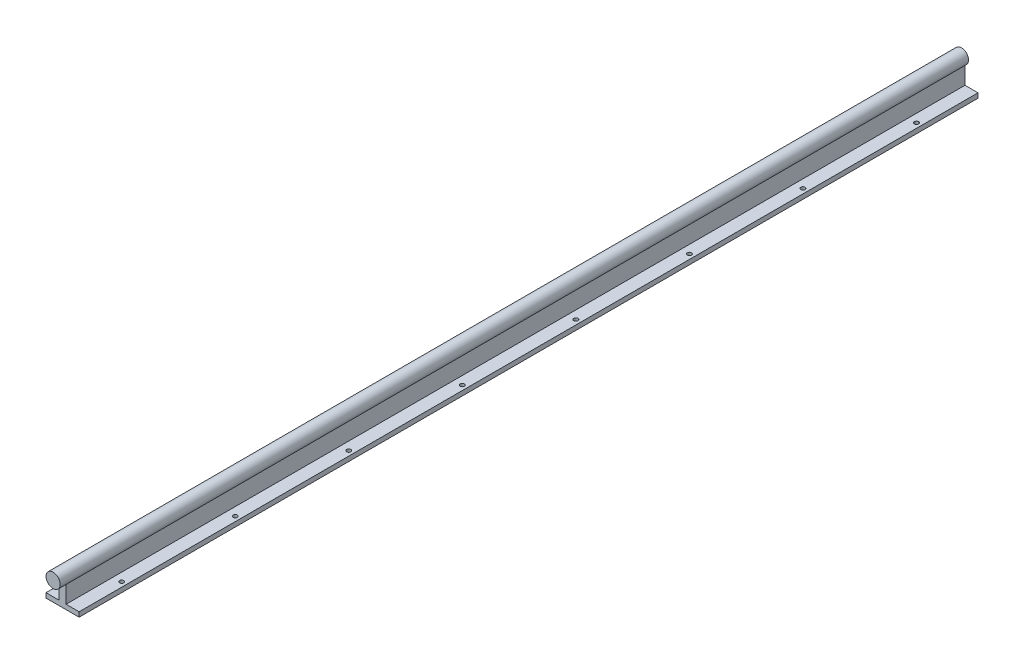
ISO-10303-21;
HEADER;
FILE_DESCRIPTION(('STEP AP214'),'2;1');
FILE_NAME('part.step','',(''),(''),'','','');
FILE_SCHEMA(('AUTOMOTIVE_DESIGN { 1 0 10303 214 1 1 1 1 }'));
ENDSEC;
DATA;
#1=APPLICATION_CONTEXT('core data for automotive mechanical design processes');
#2=APPLICATION_PROTOCOL_DEFINITION('international standard','automotive_design',2000,#1);
#3=PRODUCT_CONTEXT('',#1,'mechanical');
#4=PRODUCT('Part','Part','',(#3));
#5=PRODUCT_RELATED_PRODUCT_CATEGORY('part','',(#4));
#6=PRODUCT_DEFINITION_FORMATION('','',#4);
#7=PRODUCT_DEFINITION_CONTEXT('part definition',#1,'design');
#8=PRODUCT_DEFINITION('design','',#6,#7);
#9=PRODUCT_DEFINITION_SHAPE('','',#8);
#10=(LENGTH_UNIT() NAMED_UNIT(*) SI_UNIT(.MILLI.,.METRE.));
#11=(NAMED_UNIT(*) PLANE_ANGLE_UNIT() SI_UNIT($,.RADIAN.));
#12=(NAMED_UNIT(*) SI_UNIT($,.STERADIAN.) SOLID_ANGLE_UNIT());
#13=UNCERTAINTY_MEASURE_WITH_UNIT(LENGTH_MEASURE(1.E-05),#10,'distance_accuracy_value','');
#14=(GEOMETRIC_REPRESENTATION_CONTEXT(3) GLOBAL_UNCERTAINTY_ASSIGNED_CONTEXT((#13)) GLOBAL_UNIT_ASSIGNED_CONTEXT((#10,
#11,#12)) REPRESENTATION_CONTEXT('',''));
#15=CARTESIAN_POINT('',(0.,0.,0.));
#16=DIRECTION('',(0.,0.,1.));
#17=DIRECTION('',(1.,0.,0.));
#18=AXIS2_PLACEMENT_3D('',#15,#16,#17);
#19=CARTESIAN_POINT('',(-22.225,-38.1,1219.2));
#20=DIRECTION('',(1.,0.,0.));
#21=DIRECTION('',(0.,1.,0.));
#22=AXIS2_PLACEMENT_3D('',#19,#20,#21);
#23=PLANE('',#22);
#24=DIRECTION('',(0.,-1.,0.));
#25=VECTOR('',#24,1.);
#26=CARTESIAN_POINT('',(-22.225,-38.1,1206.5));
#27=LINE('',#26,#25);
#28=CARTESIAN_POINT('',(-22.225,-31.75,1206.5));
#29=VERTEX_POINT('',#28);
#30=CARTESIAN_POINT('',(-22.225,-38.1,1206.5));
#31=VERTEX_POINT('',#30);
#32=EDGE_CURVE('E110',#29,#31,#27,.T.);
#33=ORIENTED_EDGE('',*,*,#32,.F.);
#34=DIRECTION('',(0.,0.,-1.));
#35=VECTOR('',#34,1.);
#36=CARTESIAN_POINT('',(-22.225,-31.75,1219.2));
#37=LINE('',#36,#35);
#38=CARTESIAN_POINT('',(-22.225,-31.75,0.));
#39=VERTEX_POINT('',#38);
#40=EDGE_CURVE('E45',#29,#39,#37,.T.);
#41=ORIENTED_EDGE('',*,*,#40,.T.);
#42=DIRECTION('',(0.,-1.,0.));
#43=VECTOR('',#42,1.);
#44=CARTESIAN_POINT('',(-22.225,-38.1,0.));
#45=LINE('',#44,#43);
#46=CARTESIAN_POINT('',(-22.225,-38.1,0.));
#47=VERTEX_POINT('',#46);
#48=EDGE_CURVE('E256',#39,#47,#45,.T.);
#49=ORIENTED_EDGE('',*,*,#48,.T.);
#50=DIRECTION('',(0.,0.,-1.));
#51=VECTOR('',#50,1.);
#52=CARTESIAN_POINT('',(-22.225,-38.1,1219.2));
#53=LINE('',#52,#51);
#54=EDGE_CURVE('E129',#31,#47,#53,.T.);
#55=ORIENTED_EDGE('',*,*,#54,.F.);
#56=EDGE_LOOP('',(#33,#41,#49,#55));
#57=FACE_BOUND('',#56,.T.);
#58=ADVANCED_FACE('F30',(#57),#23,.F.);
#59=CARTESIAN_POINT('',(-22.225,-38.1,1219.2));
#60=DIRECTION('',(0.,1.,0.));
#61=DIRECTION('',(0.,0.,1.));
#62=AXIS2_PLACEMENT_3D('',#59,#60,#61);
#63=PLANE('',#62);
#64=CARTESIAN_POINT('',(15.875,-38.1,1143.));
#65=DIRECTION('',(0.,-1.,0.));
#66=DIRECTION('',(0.,0.,-1.));
#67=AXIS2_PLACEMENT_3D('',#64,#65,#66);
#68=CIRCLE('',#67,2.80669999999999);
#69=CARTESIAN_POINT('',(15.875,-38.1,1140.1933));
#70=VERTEX_POINT('',#69);
#71=EDGE_CURVE('E38',#70,#70,#68,.T.);
#72=ORIENTED_EDGE('',*,*,#71,.F.);
#73=EDGE_LOOP('',(#72));
#74=FACE_BOUND('',#73,.T.);
#75=CARTESIAN_POINT('',(15.875,-38.1,990.6));
#76=DIRECTION('',(0.,-1.,0.));
#77=DIRECTION('',(0.,0.,-1.));
#78=AXIS2_PLACEMENT_3D('',#75,#76,#77);
#79=CIRCLE('',#78,2.80669999999999);
#80=CARTESIAN_POINT('',(15.875,-38.1,987.7933));
#81=VERTEX_POINT('',#80);
#82=EDGE_CURVE('E194',#81,#81,#79,.T.);
#83=ORIENTED_EDGE('',*,*,#82,.F.);
#84=EDGE_LOOP('',(#83));
#85=FACE_BOUND('',#84,.T.);
#86=CARTESIAN_POINT('',(15.875,-38.1,838.2));
#87=DIRECTION('',(0.,-1.,0.));
#88=DIRECTION('',(0.,0.,-1.));
#89=AXIS2_PLACEMENT_3D('',#86,#87,#88);
#90=CIRCLE('',#89,2.80669999999999);
#91=CARTESIAN_POINT('',(15.875,-38.1,835.3933));
#92=VERTEX_POINT('',#91);
#93=EDGE_CURVE('E188',#92,#92,#90,.T.);
#94=ORIENTED_EDGE('',*,*,#93,.F.);
#95=EDGE_LOOP('',(#94));
#96=FACE_BOUND('',#95,.T.);
#97=CARTESIAN_POINT('',(15.875,-38.1,685.8));
#98=DIRECTION('',(0.,-1.,0.));
#99=DIRECTION('',(0.,0.,-1.));
#100=AXIS2_PLACEMENT_3D('',#97,#98,#99);
#101=CIRCLE('',#100,2.80669999999999);
#102=CARTESIAN_POINT('',(15.875,-38.1,682.9933));
#103=VERTEX_POINT('',#102);
#104=EDGE_CURVE('E182',#103,#103,#101,.T.);
#105=ORIENTED_EDGE('',*,*,#104,.F.);
#106=EDGE_LOOP('',(#105));
#107=FACE_BOUND('',#106,.T.);
#108=CARTESIAN_POINT('',(15.875,-38.1,533.4));
#109=DIRECTION('',(0.,-1.,0.));
#110=DIRECTION('',(0.,0.,-1.));
#111=AXIS2_PLACEMENT_3D('',#108,#109,#110);
#112=CIRCLE('',#111,2.80669999999999);
#113=CARTESIAN_POINT('',(15.875,-38.1,530.5933));
#114=VERTEX_POINT('',#113);
#115=EDGE_CURVE('E176',#114,#114,#112,.T.);
#116=ORIENTED_EDGE('',*,*,#115,.F.);
#117=EDGE_LOOP('',(#116));
#118=FACE_BOUND('',#117,.T.);
#119=CARTESIAN_POINT('',(15.875,-38.1,381.));
#120=DIRECTION('',(0.,-1.,0.));
#121=DIRECTION('',(0.,0.,-1.));
#122=AXIS2_PLACEMENT_3D('',#119,#120,#121);
#123=CIRCLE('',#122,2.80669999999999);
#124=CARTESIAN_POINT('',(15.875,-38.1,378.1933));
#125=VERTEX_POINT('',#124);
#126=EDGE_CURVE('E170',#125,#125,#123,.T.);
#127=ORIENTED_EDGE('',*,*,#126,.F.);
#128=EDGE_LOOP('',(#127));
#129=FACE_BOUND('',#128,.T.);
#130=CARTESIAN_POINT('',(-15.875,-38.1,1143.));
#131=DIRECTION('',(0.,-1.,0.));
#132=DIRECTION('',(0.,0.,-1.));
#133=AXIS2_PLACEMENT_3D('',#130,#131,#132);
#134=CIRCLE('',#133,2.80669999999999);
#135=CARTESIAN_POINT('',(-15.875,-38.1,1140.1933));
#136=VERTEX_POINT('',#135);
#137=EDGE_CURVE('E164',#136,#136,#134,.T.);
#138=ORIENTED_EDGE('',*,*,#137,.F.);
#139=EDGE_LOOP('',(#138));
#140=FACE_BOUND('',#139,.T.);
#141=CARTESIAN_POINT('',(-15.875,-38.1,990.6));
#142=DIRECTION('',(0.,-1.,0.));
#143=DIRECTION('',(0.,0.,-1.));
#144=AXIS2_PLACEMENT_3D('',#141,#142,#143);
#145=CIRCLE('',#144,2.80669999999999);
#146=CARTESIAN_POINT('',(-15.875,-38.1,987.7933));
#147=VERTEX_POINT('',#146);
#148=EDGE_CURVE('E158',#147,#147,#145,.T.);
#149=ORIENTED_EDGE('',*,*,#148,.F.);
#150=EDGE_LOOP('',(#149));
#151=FACE_BOUND('',#150,.T.);
#152=CARTESIAN_POINT('',(-15.875,-38.1,838.2));
#153=DIRECTION('',(0.,-1.,0.));
#154=DIRECTION('',(0.,0.,-1.));
#155=AXIS2_PLACEMENT_3D('',#152,#153,#154);
#156=CIRCLE('',#155,2.80669999999999);
#157=CARTESIAN_POINT('',(-15.875,-38.1,835.3933));
#158=VERTEX_POINT('',#157);
#159=EDGE_CURVE('E152',#158,#158,#156,.T.);
#160=ORIENTED_EDGE('',*,*,#159,.F.);
#161=EDGE_LOOP('',(#160));
#162=FACE_BOUND('',#161,.T.);
#163=CARTESIAN_POINT('',(-15.875,-38.1,685.8));
#164=DIRECTION('',(0.,-1.,0.));
#165=DIRECTION('',(0.,0.,-1.));
#166=AXIS2_PLACEMENT_3D('',#163,#164,#165);
#167=CIRCLE('',#166,2.80669999999999);
#168=CARTESIAN_POINT('',(-15.875,-38.1,682.9933));
#169=VERTEX_POINT('',#168);
#170=EDGE_CURVE('E146',#169,#169,#167,.T.);
#171=ORIENTED_EDGE('',*,*,#170,.F.);
#172=EDGE_LOOP('',(#171));
#173=FACE_BOUND('',#172,.T.);
#174=CARTESIAN_POINT('',(-15.875,-38.1,533.4));
#175=DIRECTION('',(0.,-1.,0.));
#176=DIRECTION('',(0.,0.,-1.));
#177=AXIS2_PLACEMENT_3D('',#174,#175,#176);
#178=CIRCLE('',#177,2.80669999999999);
#179=CARTESIAN_POINT('',(-15.875,-38.1,530.5933));
#180=VERTEX_POINT('',#179);
#181=EDGE_CURVE('E140',#180,#180,#178,.T.);
#182=ORIENTED_EDGE('',*,*,#181,.F.);
#183=EDGE_LOOP('',(#182));
#184=FACE_BOUND('',#183,.T.);
#185=CARTESIAN_POINT('',(-15.875,-38.1,381.));
#186=DIRECTION('',(0.,-1.,0.));
#187=DIRECTION('',(0.,0.,-1.));
#188=AXIS2_PLACEMENT_3D('',#185,#186,#187);
#189=CIRCLE('',#188,2.80669999999999);
#190=CARTESIAN_POINT('',(-15.875,-38.1,378.1933));
#191=VERTEX_POINT('',#190);
#192=EDGE_CURVE('E134',#191,#191,#189,.T.);
#193=ORIENTED_EDGE('',*,*,#192,.F.);
#194=EDGE_LOOP('',(#193));
#195=FACE_BOUND('',#194,.T.);
#196=CARTESIAN_POINT('',(15.875,-38.1,76.2));
#197=DIRECTION('',(0.,-1.,0.));
#198=DIRECTION('',(0.,0.,-1.));
#199=AXIS2_PLACEMENT_3D('',#196,#197,#198);
#200=CIRCLE('',#199,2.80669999999999);
#201=CARTESIAN_POINT('',(15.875,-38.1,73.3933));
#202=VERTEX_POINT('',#201);
#203=EDGE_CURVE('E233',#202,#202,#200,.T.);
#204=ORIENTED_EDGE('',*,*,#203,.F.);
#205=EDGE_LOOP('',(#204));
#206=FACE_BOUND('',#205,.T.);
#207=CARTESIAN_POINT('',(-15.875,-38.1,76.2));
#208=DIRECTION('',(0.,-1.,0.));
#209=DIRECTION('',(0.,0.,-1.));
#210=AXIS2_PLACEMENT_3D('',#207,#208,#209);
#211=CIRCLE('',#210,2.80669999999999);
#212=CARTESIAN_POINT('',(-15.875,-38.1,73.3933));
#213=VERTEX_POINT('',#212);
#214=EDGE_CURVE('E237',#213,#213,#211,.T.);
#215=ORIENTED_EDGE('',*,*,#214,.F.);
#216=EDGE_LOOP('',(#215));
#217=FACE_BOUND('',#216,.T.);
#218=CARTESIAN_POINT('',(-15.875,-38.1,228.6));
#219=DIRECTION('',(0.,-1.,0.));
#220=DIRECTION('',(0.,0.,-1.));
#221=AXIS2_PLACEMENT_3D('',#218,#219,#220);
#222=CIRCLE('',#221,2.80669999999999);
#223=CARTESIAN_POINT('',(-15.875,-38.1,225.7933));
#224=VERTEX_POINT('',#223);
#225=EDGE_CURVE('E241',#224,#224,#222,.T.);
#226=ORIENTED_EDGE('',*,*,#225,.F.);
#227=EDGE_LOOP('',(#226));
#228=FACE_BOUND('',#227,.T.);
#229=CARTESIAN_POINT('',(15.875,-38.1,228.6));
#230=DIRECTION('',(0.,-1.,0.));
#231=DIRECTION('',(0.,0.,-1.));
#232=AXIS2_PLACEMENT_3D('',#229,#230,#231);
#233=CIRCLE('',#232,2.80669999999999);
#234=CARTESIAN_POINT('',(15.875,-38.1,225.7933));
#235=VERTEX_POINT('',#234);
#236=EDGE_CURVE('E245',#235,#235,#233,.T.);
#237=ORIENTED_EDGE('',*,*,#236,.F.);
#238=EDGE_LOOP('',(#237));
#239=FACE_BOUND('',#238,.T.);
#240=DIRECTION('',(1.,0.,0.));
#241=VECTOR('',#240,1.);
#242=CARTESIAN_POINT('',(-22.225,-38.1,1206.5));
#243=LINE('',#242,#241);
#244=CARTESIAN_POINT('',(22.225,-38.1,1206.5));
#245=VERTEX_POINT('',#244);
#246=EDGE_CURVE('E248',#31,#245,#243,.T.);
#247=ORIENTED_EDGE('',*,*,#246,.F.);
#248=ORIENTED_EDGE('',*,*,#54,.T.);
#249=DIRECTION('',(1.,0.,0.));
#250=VECTOR('',#249,1.);
#251=CARTESIAN_POINT('',(-22.225,-38.1,0.));
#252=LINE('',#251,#250);
#253=CARTESIAN_POINT('',(22.225,-38.1,0.));
#254=VERTEX_POINT('',#253);
#255=EDGE_CURVE('E259',#47,#254,#252,.T.);
#256=ORIENTED_EDGE('',*,*,#255,.T.);
#257=DIRECTION('',(0.,0.,-1.));
#258=VECTOR('',#257,1.);
#259=CARTESIAN_POINT('',(22.225,-38.1,1219.2));
#260=LINE('',#259,#258);
#261=EDGE_CURVE('E127',#245,#254,#260,.T.);
#262=ORIENTED_EDGE('',*,*,#261,.F.);
#263=EDGE_LOOP('',(#247,#248,#256,#262));
#264=FACE_BOUND('',#263,.T.);
#265=ADVANCED_FACE('F203',(#74,#85,#96,#107,#118,#129,#140,#151,#162,#173,#184,#195,#206,#217,
#228,#239,#264),#63,.F.);
#266=CARTESIAN_POINT('',(22.225,-38.1,1219.2));
#267=DIRECTION('',(-1.,0.,0.));
#268=DIRECTION('',(0.,-1.,0.));
#269=AXIS2_PLACEMENT_3D('',#266,#267,#268);
#270=PLANE('',#269);
#271=DIRECTION('',(0.,1.,0.));
#272=VECTOR('',#271,1.);
#273=CARTESIAN_POINT('',(22.225,-38.1,1206.5));
#274=LINE('',#273,#272);
#275=CARTESIAN_POINT('',(22.225,-31.75,1206.5));
#276=VERTEX_POINT('',#275);
#277=EDGE_CURVE('E253',#245,#276,#274,.T.);
#278=ORIENTED_EDGE('',*,*,#277,.F.);
#279=ORIENTED_EDGE('',*,*,#261,.T.);
#280=DIRECTION('',(0.,1.,0.));
#281=VECTOR('',#280,1.);
#282=CARTESIAN_POINT('',(22.225,-38.1,0.));
#283=LINE('',#282,#281);
#284=CARTESIAN_POINT('',(22.225,-31.75,0.));
#285=VERTEX_POINT('',#284);
#286=EDGE_CURVE('E262',#254,#285,#283,.T.);
#287=ORIENTED_EDGE('',*,*,#286,.T.);
#288=DIRECTION('',(0.,0.,-1.));
#289=VECTOR('',#288,1.);
#290=CARTESIAN_POINT('',(22.225,-31.75,1219.2));
#291=LINE('',#290,#289);
#292=EDGE_CURVE('E125',#276,#285,#291,.T.);
#293=ORIENTED_EDGE('',*,*,#292,.F.);
#294=EDGE_LOOP('',(#278,#279,#287,#293));
#295=FACE_BOUND('',#294,.T.);
#296=ADVANCED_FACE('F206',(#295),#270,.F.);
#297=CARTESIAN_POINT('',(22.225,-31.75,1219.2));
#298=DIRECTION('',(0.,-1.,0.));
#299=DIRECTION('',(0.,0.,-1.));
#300=AXIS2_PLACEMENT_3D('',#297,#298,#299);
#301=PLANE('',#300);
#302=CARTESIAN_POINT('',(15.875,-31.75,1143.));
#303=DIRECTION('',(0.,-1.,0.));
#304=DIRECTION('',(0.,0.,-1.));
#305=AXIS2_PLACEMENT_3D('',#302,#303,#304);
#306=CIRCLE('',#305,2.80669999999999);
#307=CARTESIAN_POINT('',(15.875,-31.75,1140.1933));
#308=VERTEX_POINT('',#307);
#309=EDGE_CURVE('E197',#308,#308,#306,.T.);
#310=ORIENTED_EDGE('',*,*,#309,.T.);
#311=EDGE_LOOP('',(#310));
#312=FACE_BOUND('',#311,.T.);
#313=CARTESIAN_POINT('',(15.875,-31.75,990.6));
#314=DIRECTION('',(0.,-1.,0.));
#315=DIRECTION('',(0.,0.,-1.));
#316=AXIS2_PLACEMENT_3D('',#313,#314,#315);
#317=CIRCLE('',#316,2.80669999999999);
#318=CARTESIAN_POINT('',(15.875,-31.75,987.7933));
#319=VERTEX_POINT('',#318);
#320=EDGE_CURVE('E191',#319,#319,#317,.T.);
#321=ORIENTED_EDGE('',*,*,#320,.T.);
#322=EDGE_LOOP('',(#321));
#323=FACE_BOUND('',#322,.T.);
#324=CARTESIAN_POINT('',(15.875,-31.75,838.2));
#325=DIRECTION('',(0.,-1.,0.));
#326=DIRECTION('',(0.,0.,-1.));
#327=AXIS2_PLACEMENT_3D('',#324,#325,#326);
#328=CIRCLE('',#327,2.80669999999999);
#329=CARTESIAN_POINT('',(15.875,-31.75,835.3933));
#330=VERTEX_POINT('',#329);
#331=EDGE_CURVE('E185',#330,#330,#328,.T.);
#332=ORIENTED_EDGE('',*,*,#331,.T.);
#333=EDGE_LOOP('',(#332));
#334=FACE_BOUND('',#333,.T.);
#335=CARTESIAN_POINT('',(15.875,-31.75,685.8));
#336=DIRECTION('',(0.,-1.,0.));
#337=DIRECTION('',(0.,0.,-1.));
#338=AXIS2_PLACEMENT_3D('',#335,#336,#337);
#339=CIRCLE('',#338,2.80669999999999);
#340=CARTESIAN_POINT('',(15.875,-31.75,682.9933));
#341=VERTEX_POINT('',#340);
#342=EDGE_CURVE('E179',#341,#341,#339,.T.);
#343=ORIENTED_EDGE('',*,*,#342,.T.);
#344=EDGE_LOOP('',(#343));
#345=FACE_BOUND('',#344,.T.);
#346=CARTESIAN_POINT('',(15.875,-31.75,533.4));
#347=DIRECTION('',(0.,-1.,0.));
#348=DIRECTION('',(0.,0.,-1.));
#349=AXIS2_PLACEMENT_3D('',#346,#347,#348);
#350=CIRCLE('',#349,2.80669999999999);
#351=CARTESIAN_POINT('',(15.875,-31.75,530.5933));
#352=VERTEX_POINT('',#351);
#353=EDGE_CURVE('E173',#352,#352,#350,.T.);
#354=ORIENTED_EDGE('',*,*,#353,.T.);
#355=EDGE_LOOP('',(#354));
#356=FACE_BOUND('',#355,.T.);
#357=CARTESIAN_POINT('',(15.875,-31.75,381.));
#358=DIRECTION('',(0.,-1.,0.));
#359=DIRECTION('',(0.,0.,-1.));
#360=AXIS2_PLACEMENT_3D('',#357,#358,#359);
#361=CIRCLE('',#360,2.80669999999999);
#362=CARTESIAN_POINT('',(15.875,-31.75,378.1933));
#363=VERTEX_POINT('',#362);
#364=EDGE_CURVE('E167',#363,#363,#361,.T.);
#365=ORIENTED_EDGE('',*,*,#364,.T.);
#366=EDGE_LOOP('',(#365));
#367=FACE_BOUND('',#366,.T.);
#368=CARTESIAN_POINT('',(15.875,-31.75,76.2));
#369=DIRECTION('',(0.,-1.,0.));
#370=DIRECTION('',(0.,0.,-1.));
#371=AXIS2_PLACEMENT_3D('',#368,#369,#370);
#372=CIRCLE('',#371,2.80669999999999);
#373=CARTESIAN_POINT('',(15.875,-31.75,73.3933));
#374=VERTEX_POINT('',#373);
#375=EDGE_CURVE('E260',#374,#374,#372,.T.);
#376=ORIENTED_EDGE('',*,*,#375,.T.);
#377=EDGE_LOOP('',(#376));
#378=FACE_BOUND('',#377,.T.);
#379=CARTESIAN_POINT('',(15.875,-31.75,228.6));
#380=DIRECTION('',(0.,-1.,0.));
#381=DIRECTION('',(0.,0.,-1.));
#382=AXIS2_PLACEMENT_3D('',#379,#380,#381);
#383=CIRCLE('',#382,2.80669999999999);
#384=CARTESIAN_POINT('',(15.875,-31.75,225.7933));
#385=VERTEX_POINT('',#384);
#386=EDGE_CURVE('E376',#385,#385,#383,.T.);
#387=ORIENTED_EDGE('',*,*,#386,.T.);
#388=EDGE_LOOP('',(#387));
#389=FACE_BOUND('',#388,.T.);
#390=DIRECTION('',(-1.,0.,0.));
#391=VECTOR('',#390,1.);
#392=CARTESIAN_POINT('',(22.225,-31.75,1206.5));
#393=LINE('',#392,#391);
#394=CARTESIAN_POINT('',(4.7625,-31.75,1206.5));
#395=VERTEX_POINT('',#394);
#396=EDGE_CURVE('E379',#276,#395,#393,.T.);
#397=ORIENTED_EDGE('',*,*,#396,.F.);
#398=ORIENTED_EDGE('',*,*,#292,.T.);
#399=DIRECTION('',(-1.,0.,0.));
#400=VECTOR('',#399,1.);
#401=CARTESIAN_POINT('',(22.225,-31.75,0.));
#402=LINE('',#401,#400);
#403=CARTESIAN_POINT('',(4.7625,-31.75,0.));
#404=VERTEX_POINT('',#403);
#405=EDGE_CURVE('E270',#285,#404,#402,.T.);
#406=ORIENTED_EDGE('',*,*,#405,.T.);
#407=DIRECTION('',(0.,0.,-1.));
#408=VECTOR('',#407,1.);
#409=CARTESIAN_POINT('',(4.7625,-31.75,1219.2));
#410=LINE('',#409,#408);
#411=EDGE_CURVE('E119',#395,#404,#410,.T.);
#412=ORIENTED_EDGE('',*,*,#411,.F.);
#413=EDGE_LOOP('',(#397,#398,#406,#412));
#414=FACE_BOUND('',#413,.T.);
#415=ADVANCED_FACE('F357',(#312,#323,#334,#345,#356,#367,#378,#389,#414),#301,.F.);
#416=CARTESIAN_POINT('',(4.7625,-31.75,1219.2));
#417=DIRECTION('',(-1.,0.,0.));
#418=DIRECTION('',(0.,0.,1.));
#419=AXIS2_PLACEMENT_3D('',#416,#417,#418);
#420=PLANE('',#419);
#421=DIRECTION('',(0.,1.,0.));
#422=VECTOR('',#421,1.);
#423=CARTESIAN_POINT('',(4.7625,-31.75,1206.5));
#424=LINE('',#423,#422);
#425=CARTESIAN_POINT('',(4.7625,-8.24889197104678,1206.5));
#426=VERTEX_POINT('',#425);
#427=EDGE_CURVE('E101',#395,#426,#424,.T.);
#428=ORIENTED_EDGE('',*,*,#427,.F.);
#429=ORIENTED_EDGE('',*,*,#411,.T.);
#430=DIRECTION('',(0.,1.,0.));
#431=VECTOR('',#430,1.);
#432=CARTESIAN_POINT('',(4.7625,-31.75,0.));
#433=LINE('',#432,#431);
#434=CARTESIAN_POINT('',(4.7625,-8.24889197104678,0.));
#435=VERTEX_POINT('',#434);
#436=EDGE_CURVE('E273',#404,#435,#433,.T.);
#437=ORIENTED_EDGE('',*,*,#436,.T.);
#438=DIRECTION('',(0.,0.,-1.));
#439=VECTOR('',#438,1.);
#440=CARTESIAN_POINT('',(4.7625,-8.24889197104678,1219.2));
#441=LINE('',#440,#439);
#442=EDGE_CURVE('E117',#426,#435,#441,.T.);
#443=ORIENTED_EDGE('',*,*,#442,.F.);
#444=EDGE_LOOP('',(#428,#429,#437,#443));
#445=FACE_BOUND('',#444,.T.);
#446=ADVANCED_FACE('F360',(#445),#420,.F.);
#447=CARTESIAN_POINT('',(-4.7625,-31.75,1219.2));
#448=DIRECTION('',(1.,0.,0.));
#449=DIRECTION('',(0.,0.,-1.));
#450=AXIS2_PLACEMENT_3D('',#447,#448,#449);
#451=PLANE('',#450);
#452=DIRECTION('',(0.,-1.,0.));
#453=VECTOR('',#452,1.);
#454=CARTESIAN_POINT('',(-4.7625,-31.75,1206.5));
#455=LINE('',#454,#453);
#456=CARTESIAN_POINT('',(-4.7625,-8.24889197104678,1206.5));
#457=VERTEX_POINT('',#456);
#458=CARTESIAN_POINT('',(-4.7625,-31.75,1206.5));
#459=VERTEX_POINT('',#458);
#460=EDGE_CURVE('E99',#457,#459,#455,.T.);
#461=ORIENTED_EDGE('',*,*,#460,.F.);
#462=DIRECTION('',(0.,0.,-1.));
#463=VECTOR('',#462,1.);
#464=CARTESIAN_POINT('',(-4.76250000000001,-8.24889197104677,1219.2));
#465=LINE('',#464,#463);
#466=CARTESIAN_POINT('',(-4.76250000000001,-8.24889197104677,0.));
#467=VERTEX_POINT('',#466);
#468=EDGE_CURVE('E108',#457,#467,#465,.T.);
#469=ORIENTED_EDGE('',*,*,#468,.T.);
#470=DIRECTION('',(0.,-1.,0.));
#471=VECTOR('',#470,1.);
#472=CARTESIAN_POINT('',(-4.7625,-31.75,0.));
#473=LINE('',#472,#471);
#474=CARTESIAN_POINT('',(-4.7625,-31.75,0.));
#475=VERTEX_POINT('',#474);
#476=EDGE_CURVE('E277',#467,#475,#473,.T.);
#477=ORIENTED_EDGE('',*,*,#476,.T.);
#478=DIRECTION('',(0.,0.,-1.));
#479=VECTOR('',#478,1.);
#480=CARTESIAN_POINT('',(-4.7625,-31.75,1219.2));
#481=LINE('',#480,#479);
#482=EDGE_CURVE('E52',#459,#475,#481,.T.);
#483=ORIENTED_EDGE('',*,*,#482,.F.);
#484=EDGE_LOOP('',(#461,#469,#477,#483));
#485=FACE_BOUND('',#484,.T.);
#486=ADVANCED_FACE('F107',(#485),#451,.F.);
#487=CARTESIAN_POINT('',(-22.225,-31.75,1219.2));
#488=DIRECTION('',(0.,-1.,0.));
#489=DIRECTION('',(0.,0.,-1.));
#490=AXIS2_PLACEMENT_3D('',#487,#488,#489);
#491=PLANE('',#490);
#492=CARTESIAN_POINT('',(-15.875,-31.75,1143.));
#493=DIRECTION('',(0.,-1.,0.));
#494=DIRECTION('',(0.,0.,-1.));
#495=AXIS2_PLACEMENT_3D('',#492,#493,#494);
#496=CIRCLE('',#495,2.80669999999999);
#497=CARTESIAN_POINT('',(-15.875,-31.75,1140.1933));
#498=VERTEX_POINT('',#497);
#499=EDGE_CURVE('E161',#498,#498,#496,.T.);
#500=ORIENTED_EDGE('',*,*,#499,.T.);
#501=EDGE_LOOP('',(#500));
#502=FACE_BOUND('',#501,.T.);
#503=CARTESIAN_POINT('',(-15.875,-31.75,990.6));
#504=DIRECTION('',(0.,-1.,0.));
#505=DIRECTION('',(0.,0.,-1.));
#506=AXIS2_PLACEMENT_3D('',#503,#504,#505);
#507=CIRCLE('',#506,2.80669999999999);
#508=CARTESIAN_POINT('',(-15.875,-31.75,987.7933));
#509=VERTEX_POINT('',#508);
#510=EDGE_CURVE('E155',#509,#509,#507,.T.);
#511=ORIENTED_EDGE('',*,*,#510,.T.);
#512=EDGE_LOOP('',(#511));
#513=FACE_BOUND('',#512,.T.);
#514=CARTESIAN_POINT('',(-15.875,-31.75,838.2));
#515=DIRECTION('',(0.,-1.,0.));
#516=DIRECTION('',(0.,0.,-1.));
#517=AXIS2_PLACEMENT_3D('',#514,#515,#516);
#518=CIRCLE('',#517,2.80669999999999);
#519=CARTESIAN_POINT('',(-15.875,-31.75,835.3933));
#520=VERTEX_POINT('',#519);
#521=EDGE_CURVE('E149',#520,#520,#518,.T.);
#522=ORIENTED_EDGE('',*,*,#521,.T.);
#523=EDGE_LOOP('',(#522));
#524=FACE_BOUND('',#523,.T.);
#525=CARTESIAN_POINT('',(-15.875,-31.75,685.8));
#526=DIRECTION('',(0.,-1.,0.));
#527=DIRECTION('',(0.,0.,-1.));
#528=AXIS2_PLACEMENT_3D('',#525,#526,#527);
#529=CIRCLE('',#528,2.80669999999999);
#530=CARTESIAN_POINT('',(-15.875,-31.75,682.9933));
#531=VERTEX_POINT('',#530);
#532=EDGE_CURVE('E143',#531,#531,#529,.T.);
#533=ORIENTED_EDGE('',*,*,#532,.T.);
#534=EDGE_LOOP('',(#533));
#535=FACE_BOUND('',#534,.T.);
#536=CARTESIAN_POINT('',(-15.875,-31.75,533.4));
#537=DIRECTION('',(0.,-1.,0.));
#538=DIRECTION('',(0.,0.,-1.));
#539=AXIS2_PLACEMENT_3D('',#536,#537,#538);
#540=CIRCLE('',#539,2.80669999999999);
#541=CARTESIAN_POINT('',(-15.875,-31.75,530.5933));
#542=VERTEX_POINT('',#541);
#543=EDGE_CURVE('E137',#542,#542,#540,.T.);
#544=ORIENTED_EDGE('',*,*,#543,.T.);
#545=EDGE_LOOP('',(#544));
#546=FACE_BOUND('',#545,.T.);
#547=CARTESIAN_POINT('',(-15.875,-31.75,381.));
#548=DIRECTION('',(0.,-1.,0.));
#549=DIRECTION('',(0.,0.,-1.));
#550=AXIS2_PLACEMENT_3D('',#547,#548,#549);
#551=CIRCLE('',#550,2.80669999999999);
#552=CARTESIAN_POINT('',(-15.875,-31.75,378.1933));
#553=VERTEX_POINT('',#552);
#554=EDGE_CURVE('E131',#553,#553,#551,.T.);
#555=ORIENTED_EDGE('',*,*,#554,.T.);
#556=EDGE_LOOP('',(#555));
#557=FACE_BOUND('',#556,.T.);
#558=CARTESIAN_POINT('',(-15.875,-31.75,76.2));
#559=DIRECTION('',(0.,-1.,0.));
#560=DIRECTION('',(0.,0.,-1.));
#561=AXIS2_PLACEMENT_3D('',#558,#559,#560);
#562=CIRCLE('',#561,2.80669999999999);
#563=CARTESIAN_POINT('',(-15.875,-31.75,73.3933));
#564=VERTEX_POINT('',#563);
#565=EDGE_CURVE('E397',#564,#564,#562,.T.);
#566=ORIENTED_EDGE('',*,*,#565,.T.);
#567=EDGE_LOOP('',(#566));
#568=FACE_BOUND('',#567,.T.);
#569=CARTESIAN_POINT('',(-15.875,-31.75,228.6));
#570=DIRECTION('',(0.,-1.,0.));
#571=DIRECTION('',(0.,0.,-1.));
#572=AXIS2_PLACEMENT_3D('',#569,#570,#571);
#573=CIRCLE('',#572,2.80669999999999);
#574=CARTESIAN_POINT('',(-15.875,-31.75,225.7933));
#575=VERTEX_POINT('',#574);
#576=EDGE_CURVE('E392',#575,#575,#573,.T.);
#577=ORIENTED_EDGE('',*,*,#576,.T.);
#578=EDGE_LOOP('',(#577));
#579=FACE_BOUND('',#578,.T.);
#580=DIRECTION('',(-1.,0.,0.));
#581=VECTOR('',#580,1.);
#582=CARTESIAN_POINT('',(-22.225,-31.75,1206.5));
#583=LINE('',#582,#581);
#584=EDGE_CURVE('E12',#459,#29,#583,.T.);
#585=ORIENTED_EDGE('',*,*,#584,.F.);
#586=ORIENTED_EDGE('',*,*,#482,.T.);
#587=DIRECTION('',(-1.,0.,0.));
#588=VECTOR('',#587,1.);
#589=CARTESIAN_POINT('',(-22.225,-31.75,0.));
#590=LINE('',#589,#588);
#591=EDGE_CURVE('E279',#475,#39,#590,.T.);
#592=ORIENTED_EDGE('',*,*,#591,.T.);
#593=ORIENTED_EDGE('',*,*,#40,.F.);
#594=EDGE_LOOP('',(#585,#586,#592,#593));
#595=FACE_BOUND('',#594,.T.);
#596=ADVANCED_FACE('F296',(#502,#513,#524,#535,#546,#557,#568,#579,#595),#491,.F.);
#597=CARTESIAN_POINT('',(0.,0.,1219.2));
#598=DIRECTION('',(0.,0.,1.));
#599=DIRECTION('',(1.,0.,0.));
#600=AXIS2_PLACEMENT_3D('',#597,#598,#599);
#601=PLANE('',#600);
#602=CARTESIAN_POINT('',(0.,0.,1219.2));
#603=DIRECTION('',(0.,0.,1.));
#604=DIRECTION('',(1.,0.,0.));
#605=AXIS2_PLACEMENT_3D('',#602,#603,#604);
#606=CIRCLE('',#605,9.525);
#607=CARTESIAN_POINT('',(9.525,0.,1219.2));
#608=VERTEX_POINT('',#607);
#609=EDGE_CURVE('E281',#608,#608,#606,.T.);
#610=ORIENTED_EDGE('',*,*,#609,.T.);
#611=EDGE_LOOP('',(#610));
#612=FACE_BOUND('',#611,.T.);
#613=ADVANCED_FACE('F285',(#612),#601,.T.);
#614=CARTESIAN_POINT('',(0.,0.,1219.2));
#615=DIRECTION('',(0.,0.,-1.));
#616=DIRECTION('',(-1.,0.,0.));
#617=AXIS2_PLACEMENT_3D('',#614,#615,#616);
#618=CYLINDRICAL_SURFACE('',#617,9.525);
#619=CARTESIAN_POINT('',(0.,0.,1206.5));
#620=DIRECTION('',(0.,0.,1.));
#621=DIRECTION('',(1.,0.,0.));
#622=AXIS2_PLACEMENT_3D('',#619,#620,#621);
#623=CIRCLE('',#622,9.525);
#624=EDGE_CURVE('E96',#457,#426,#623,.T.);
#625=ORIENTED_EDGE('',*,*,#624,.T.);
#626=ORIENTED_EDGE('',*,*,#442,.T.);
#627=CARTESIAN_POINT('',(0.,0.,0.));
#628=DIRECTION('',(0.,0.,1.));
#629=DIRECTION('',(1.,0.,0.));
#630=AXIS2_PLACEMENT_3D('',#627,#628,#629);
#631=CIRCLE('',#630,9.525);
#632=EDGE_CURVE('E115',#435,#467,#631,.T.);
#633=ORIENTED_EDGE('',*,*,#632,.T.);
#634=ORIENTED_EDGE('',*,*,#468,.F.);
#635=EDGE_LOOP('',(#625,#626,#633,#634));
#636=FACE_BOUND('',#635,.T.);
#637=ORIENTED_EDGE('',*,*,#609,.F.);
#638=EDGE_LOOP('',(#637));
#639=FACE_BOUND('',#638,.T.);
#640=ADVANCED_FACE('F112',(#636,#639),#618,.T.);
#641=CARTESIAN_POINT('',(0.,0.,0.));
#642=DIRECTION('',(0.,0.,1.));
#643=DIRECTION('',(1.,0.,0.));
#644=AXIS2_PLACEMENT_3D('',#641,#642,#643);
#645=PLANE('',#644);
#646=ORIENTED_EDGE('',*,*,#48,.F.);
#647=ORIENTED_EDGE('',*,*,#591,.F.);
#648=ORIENTED_EDGE('',*,*,#476,.F.);
#649=ORIENTED_EDGE('',*,*,#632,.F.);
#650=ORIENTED_EDGE('',*,*,#436,.F.);
#651=ORIENTED_EDGE('',*,*,#405,.F.);
#652=ORIENTED_EDGE('',*,*,#286,.F.);
#653=ORIENTED_EDGE('',*,*,#255,.F.);
#654=EDGE_LOOP('',(#646,#647,#648,#649,#650,#651,#652,#653));
#655=FACE_BOUND('',#654,.T.);
#656=ADVANCED_FACE('F287',(#655),#645,.F.);
#657=CARTESIAN_POINT('',(15.875,-38.1,76.2));
#658=DIRECTION('',(0.,-1.,0.));
#659=DIRECTION('',(0.,0.,-1.));
#660=AXIS2_PLACEMENT_3D('',#657,#658,#659);
#661=CYLINDRICAL_SURFACE('',#660,2.80669999999999);
#662=ORIENTED_EDGE('',*,*,#375,.F.);
#663=EDGE_LOOP('',(#662));
#664=FACE_BOUND('',#663,.T.);
#665=ORIENTED_EDGE('',*,*,#203,.T.);
#666=EDGE_LOOP('',(#665));
#667=FACE_BOUND('',#666,.T.);
#668=ADVANCED_FACE('F294',(#664,#667),#661,.F.);
#669=CARTESIAN_POINT('',(-15.875,-38.1,76.2));
#670=DIRECTION('',(0.,-1.,0.));
#671=DIRECTION('',(0.,0.,-1.));
#672=AXIS2_PLACEMENT_3D('',#669,#670,#671);
#673=CYLINDRICAL_SURFACE('',#672,2.80669999999999);
#674=ORIENTED_EDGE('',*,*,#565,.F.);
#675=EDGE_LOOP('',(#674));
#676=FACE_BOUND('',#675,.T.);
#677=ORIENTED_EDGE('',*,*,#214,.T.);
#678=EDGE_LOOP('',(#677));
#679=FACE_BOUND('',#678,.T.);
#680=ADVANCED_FACE('F401',(#676,#679),#673,.F.);
#681=CARTESIAN_POINT('',(-15.875,-38.1,228.6));
#682=DIRECTION('',(0.,-1.,0.));
#683=DIRECTION('',(0.,0.,-1.));
#684=AXIS2_PLACEMENT_3D('',#681,#682,#683);
#685=CYLINDRICAL_SURFACE('',#684,2.80669999999999);
#686=ORIENTED_EDGE('',*,*,#576,.F.);
#687=EDGE_LOOP('',(#686));
#688=FACE_BOUND('',#687,.T.);
#689=ORIENTED_EDGE('',*,*,#225,.T.);
#690=EDGE_LOOP('',(#689));
#691=FACE_BOUND('',#690,.T.);
#692=ADVANCED_FACE('F311',(#688,#691),#685,.F.);
#693=CARTESIAN_POINT('',(-15.875,-38.1,381.));
#694=DIRECTION('',(0.,-1.,0.));
#695=DIRECTION('',(0.,0.,-1.));
#696=AXIS2_PLACEMENT_3D('',#693,#694,#695);
#697=CYLINDRICAL_SURFACE('',#696,2.80669999999999);
#698=ORIENTED_EDGE('',*,*,#554,.F.);
#699=EDGE_LOOP('',(#698));
#700=FACE_BOUND('',#699,.T.);
#701=ORIENTED_EDGE('',*,*,#192,.T.);
#702=EDGE_LOOP('',(#701));
#703=FACE_BOUND('',#702,.T.);
#704=ADVANCED_FACE('F307',(#700,#703),#697,.F.);
#705=CARTESIAN_POINT('',(-15.875,-38.1,533.4));
#706=DIRECTION('',(0.,-1.,0.));
#707=DIRECTION('',(0.,0.,-1.));
#708=AXIS2_PLACEMENT_3D('',#705,#706,#707);
#709=CYLINDRICAL_SURFACE('',#708,2.80669999999999);
#710=ORIENTED_EDGE('',*,*,#543,.F.);
#711=EDGE_LOOP('',(#710));
#712=FACE_BOUND('',#711,.T.);
#713=ORIENTED_EDGE('',*,*,#181,.T.);
#714=EDGE_LOOP('',(#713));
#715=FACE_BOUND('',#714,.T.);
#716=ADVANCED_FACE('F310',(#712,#715),#709,.F.);
#717=CARTESIAN_POINT('',(-15.875,-38.1,685.8));
#718=DIRECTION('',(0.,-1.,0.));
#719=DIRECTION('',(0.,0.,-1.));
#720=AXIS2_PLACEMENT_3D('',#717,#718,#719);
#721=CYLINDRICAL_SURFACE('',#720,2.80669999999999);
#722=ORIENTED_EDGE('',*,*,#532,.F.);
#723=EDGE_LOOP('',(#722));
#724=FACE_BOUND('',#723,.T.);
#725=ORIENTED_EDGE('',*,*,#170,.T.);
#726=EDGE_LOOP('',(#725));
#727=FACE_BOUND('',#726,.T.);
#728=ADVANCED_FACE('F315',(#724,#727),#721,.F.);
#729=CARTESIAN_POINT('',(-15.875,-38.1,838.2));
#730=DIRECTION('',(0.,-1.,0.));
#731=DIRECTION('',(0.,0.,-1.));
#732=AXIS2_PLACEMENT_3D('',#729,#730,#731);
#733=CYLINDRICAL_SURFACE('',#732,2.80669999999999);
#734=ORIENTED_EDGE('',*,*,#521,.F.);
#735=EDGE_LOOP('',(#734));
#736=FACE_BOUND('',#735,.T.);
#737=ORIENTED_EDGE('',*,*,#159,.T.);
#738=EDGE_LOOP('',(#737));
#739=FACE_BOUND('',#738,.T.);
#740=ADVANCED_FACE('F319',(#736,#739),#733,.F.);
#741=CARTESIAN_POINT('',(-15.875,-38.1,990.6));
#742=DIRECTION('',(0.,-1.,0.));
#743=DIRECTION('',(0.,0.,-1.));
#744=AXIS2_PLACEMENT_3D('',#741,#742,#743);
#745=CYLINDRICAL_SURFACE('',#744,2.80669999999999);
#746=ORIENTED_EDGE('',*,*,#510,.F.);
#747=EDGE_LOOP('',(#746));
#748=FACE_BOUND('',#747,.T.);
#749=ORIENTED_EDGE('',*,*,#148,.T.);
#750=EDGE_LOOP('',(#749));
#751=FACE_BOUND('',#750,.T.);
#752=ADVANCED_FACE('F323',(#748,#751),#745,.F.);
#753=CARTESIAN_POINT('',(-15.875,-38.1,1143.));
#754=DIRECTION('',(0.,-1.,0.));
#755=DIRECTION('',(0.,0.,-1.));
#756=AXIS2_PLACEMENT_3D('',#753,#754,#755);
#757=CYLINDRICAL_SURFACE('',#756,2.80669999999999);
#758=ORIENTED_EDGE('',*,*,#499,.F.);
#759=EDGE_LOOP('',(#758));
#760=FACE_BOUND('',#759,.T.);
#761=ORIENTED_EDGE('',*,*,#137,.T.);
#762=EDGE_LOOP('',(#761));
#763=FACE_BOUND('',#762,.T.);
#764=ADVANCED_FACE('F327',(#760,#763),#757,.F.);
#765=CARTESIAN_POINT('',(15.875,-38.1,228.6));
#766=DIRECTION('',(0.,-1.,0.));
#767=DIRECTION('',(0.,0.,-1.));
#768=AXIS2_PLACEMENT_3D('',#765,#766,#767);
#769=CYLINDRICAL_SURFACE('',#768,2.80669999999999);
#770=ORIENTED_EDGE('',*,*,#386,.F.);
#771=EDGE_LOOP('',(#770));
#772=FACE_BOUND('',#771,.T.);
#773=ORIENTED_EDGE('',*,*,#236,.T.);
#774=EDGE_LOOP('',(#773));
#775=FACE_BOUND('',#774,.T.);
#776=ADVANCED_FACE('F331',(#772,#775),#769,.F.);
#777=CARTESIAN_POINT('',(15.875,-38.1,381.));
#778=DIRECTION('',(0.,-1.,0.));
#779=DIRECTION('',(0.,0.,-1.));
#780=AXIS2_PLACEMENT_3D('',#777,#778,#779);
#781=CYLINDRICAL_SURFACE('',#780,2.80669999999999);
#782=ORIENTED_EDGE('',*,*,#364,.F.);
#783=EDGE_LOOP('',(#782));
#784=FACE_BOUND('',#783,.T.);
#785=ORIENTED_EDGE('',*,*,#126,.T.);
#786=EDGE_LOOP('',(#785));
#787=FACE_BOUND('',#786,.T.);
#788=ADVANCED_FACE('F333',(#784,#787),#781,.F.);
#789=CARTESIAN_POINT('',(15.875,-38.1,533.4));
#790=DIRECTION('',(0.,-1.,0.));
#791=DIRECTION('',(0.,0.,-1.));
#792=AXIS2_PLACEMENT_3D('',#789,#790,#791);
#793=CYLINDRICAL_SURFACE('',#792,2.80669999999999);
#794=ORIENTED_EDGE('',*,*,#353,.F.);
#795=EDGE_LOOP('',(#794));
#796=FACE_BOUND('',#795,.T.);
#797=ORIENTED_EDGE('',*,*,#115,.T.);
#798=EDGE_LOOP('',(#797));
#799=FACE_BOUND('',#798,.T.);
#800=ADVANCED_FACE('F336',(#796,#799),#793,.F.);
#801=CARTESIAN_POINT('',(15.875,-38.1,685.8));
#802=DIRECTION('',(0.,-1.,0.));
#803=DIRECTION('',(0.,0.,-1.));
#804=AXIS2_PLACEMENT_3D('',#801,#802,#803);
#805=CYLINDRICAL_SURFACE('',#804,2.80669999999999);
#806=ORIENTED_EDGE('',*,*,#342,.F.);
#807=EDGE_LOOP('',(#806));
#808=FACE_BOUND('',#807,.T.);
#809=ORIENTED_EDGE('',*,*,#104,.T.);
#810=EDGE_LOOP('',(#809));
#811=FACE_BOUND('',#810,.T.);
#812=ADVANCED_FACE('F340',(#808,#811),#805,.F.);
#813=CARTESIAN_POINT('',(15.875,-38.1,838.2));
#814=DIRECTION('',(0.,-1.,0.));
#815=DIRECTION('',(0.,0.,-1.));
#816=AXIS2_PLACEMENT_3D('',#813,#814,#815);
#817=CYLINDRICAL_SURFACE('',#816,2.80669999999999);
#818=ORIENTED_EDGE('',*,*,#331,.F.);
#819=EDGE_LOOP('',(#818));
#820=FACE_BOUND('',#819,.T.);
#821=ORIENTED_EDGE('',*,*,#93,.T.);
#822=EDGE_LOOP('',(#821));
#823=FACE_BOUND('',#822,.T.);
#824=ADVANCED_FACE('F344',(#820,#823),#817,.F.);
#825=CARTESIAN_POINT('',(15.875,-38.1,990.6));
#826=DIRECTION('',(0.,-1.,0.));
#827=DIRECTION('',(0.,0.,-1.));
#828=AXIS2_PLACEMENT_3D('',#825,#826,#827);
#829=CYLINDRICAL_SURFACE('',#828,2.80669999999999);
#830=ORIENTED_EDGE('',*,*,#320,.F.);
#831=EDGE_LOOP('',(#830));
#832=FACE_BOUND('',#831,.T.);
#833=ORIENTED_EDGE('',*,*,#82,.T.);
#834=EDGE_LOOP('',(#833));
#835=FACE_BOUND('',#834,.T.);
#836=ADVANCED_FACE('F347',(#832,#835),#829,.F.);
#837=CARTESIAN_POINT('',(15.875,-38.1,1143.));
#838=DIRECTION('',(0.,-1.,0.));
#839=DIRECTION('',(0.,0.,-1.));
#840=AXIS2_PLACEMENT_3D('',#837,#838,#839);
#841=CYLINDRICAL_SURFACE('',#840,2.80669999999999);
#842=ORIENTED_EDGE('',*,*,#309,.F.);
#843=EDGE_LOOP('',(#842));
#844=FACE_BOUND('',#843,.T.);
#845=ORIENTED_EDGE('',*,*,#71,.T.);
#846=EDGE_LOOP('',(#845));
#847=FACE_BOUND('',#846,.T.);
#848=ADVANCED_FACE('F32',(#844,#847),#841,.F.);
#849=CARTESIAN_POINT('',(0.,-14.2875,1206.5));
#850=DIRECTION('',(0.,0.,1.));
#851=DIRECTION('',(1.,0.,0.));
#852=AXIS2_PLACEMENT_3D('',#849,#850,#851);
#853=PLANE('',#852);
#854=ORIENTED_EDGE('',*,*,#427,.T.);
#855=ORIENTED_EDGE('',*,*,#624,.F.);
#856=ORIENTED_EDGE('',*,*,#460,.T.);
#857=ORIENTED_EDGE('',*,*,#584,.T.);
#858=ORIENTED_EDGE('',*,*,#32,.T.);
#859=ORIENTED_EDGE('',*,*,#246,.T.);
#860=ORIENTED_EDGE('',*,*,#277,.T.);
#861=ORIENTED_EDGE('',*,*,#396,.T.);
#862=EDGE_LOOP('',(#854,#855,#856,#857,#858,#859,#860,#861));
#863=FACE_BOUND('',#862,.T.);
#864=ADVANCED_FACE('F98',(#863),#853,.T.);
#865=CLOSED_SHELL('',(#58,#265,#296,#415,#446,#486,#596,#613,#640,#656,#668,#680,#692,#704,#716,
#728,#740,#752,#764,#776,#788,#800,#812,#824,#836,#848,#864));
#866=MANIFOLD_SOLID_BREP('B2',#865);
#867=ADVANCED_BREP_SHAPE_REPRESENTATION('',(#18,#866),#14);
#868=SHAPE_DEFINITION_REPRESENTATION(#9,#867);
ENDSEC;
END-ISO-10303-21;
